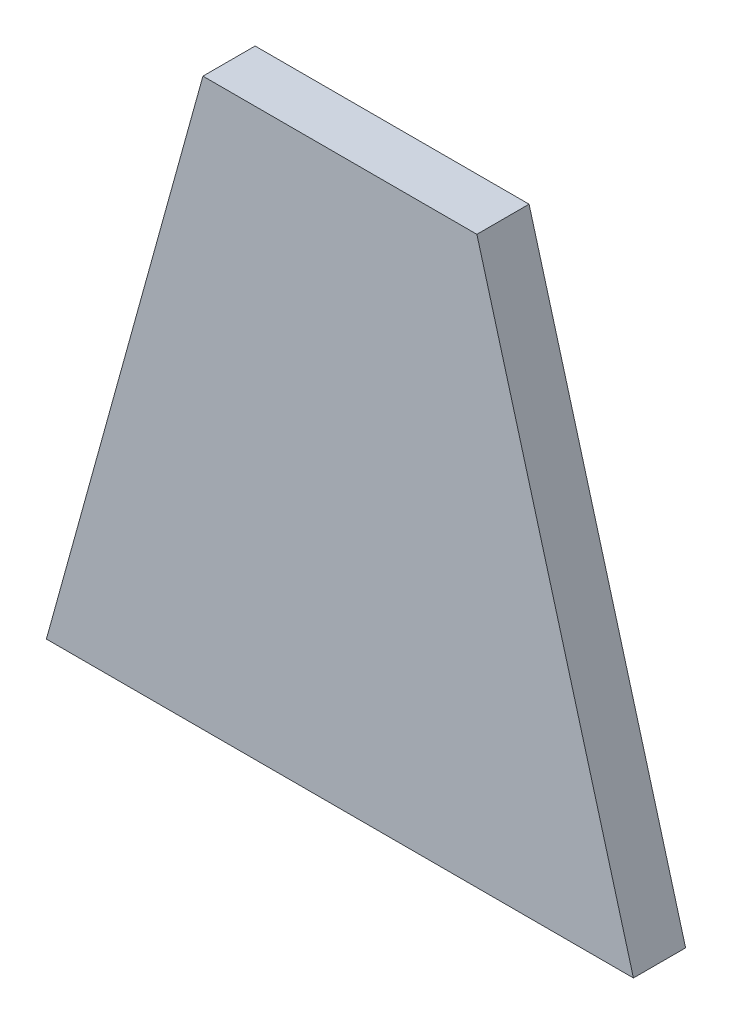
ISO-10303-21;
HEADER;
FILE_DESCRIPTION(('STEP AP214'),'2;1');
FILE_NAME('part.step','',(''),(''),'','','');
FILE_SCHEMA(('AUTOMOTIVE_DESIGN { 1 0 10303 214 1 1 1 1 }'));
ENDSEC;
DATA;
#1=APPLICATION_CONTEXT('core data for automotive mechanical design processes');
#2=APPLICATION_PROTOCOL_DEFINITION('international standard','automotive_design',2000,#1);
#3=PRODUCT_CONTEXT('',#1,'mechanical');
#4=PRODUCT('Part','Part','',(#3));
#5=PRODUCT_RELATED_PRODUCT_CATEGORY('part','',(#4));
#6=PRODUCT_DEFINITION_FORMATION('','',#4);
#7=PRODUCT_DEFINITION_CONTEXT('part definition',#1,'design');
#8=PRODUCT_DEFINITION('design','',#6,#7);
#9=PRODUCT_DEFINITION_SHAPE('','',#8);
#10=(LENGTH_UNIT() NAMED_UNIT(*) SI_UNIT(.MILLI.,.METRE.));
#11=(NAMED_UNIT(*) PLANE_ANGLE_UNIT() SI_UNIT($,.RADIAN.));
#12=(NAMED_UNIT(*) SI_UNIT($,.STERADIAN.) SOLID_ANGLE_UNIT());
#13=UNCERTAINTY_MEASURE_WITH_UNIT(LENGTH_MEASURE(1.E-05),#10,'distance_accuracy_value','');
#14=(GEOMETRIC_REPRESENTATION_CONTEXT(3) GLOBAL_UNCERTAINTY_ASSIGNED_CONTEXT((#13)) GLOBAL_UNIT_ASSIGNED_CONTEXT((#10,
#11,#12)) REPRESENTATION_CONTEXT('',''));
#15=CARTESIAN_POINT('',(0.,0.,0.));
#16=DIRECTION('',(0.,0.,1.));
#17=DIRECTION('',(1.,0.,0.));
#18=AXIS2_PLACEMENT_3D('',#15,#16,#17);
#19=CARTESIAN_POINT('',(45.,0.,4.));
#20=DIRECTION('',(0.,1.,0.));
#21=DIRECTION('',(-1.,0.,0.));
#22=AXIS2_PLACEMENT_3D('',#19,#20,#21);
#23=PLANE('',#22);
#24=DIRECTION('',(1.,0.,0.));
#25=VECTOR('',#24,1.);
#26=CARTESIAN_POINT('',(45.,0.,0.));
#27=LINE('',#26,#25);
#28=CARTESIAN_POINT('',(0.,0.,0.));
#29=VERTEX_POINT('',#28);
#30=CARTESIAN_POINT('',(45.,0.,0.));
#31=VERTEX_POINT('',#30);
#32=EDGE_CURVE('E94',#29,#31,#27,.T.);
#33=ORIENTED_EDGE('',*,*,#32,.T.);
#34=DIRECTION('',(0.,0.,-1.));
#35=VECTOR('',#34,1.);
#36=CARTESIAN_POINT('',(45.,0.,4.));
#37=LINE('',#36,#35);
#38=CARTESIAN_POINT('',(45.,0.,4.));
#39=VERTEX_POINT('',#38);
#40=EDGE_CURVE('E11',#39,#31,#37,.T.);
#41=ORIENTED_EDGE('',*,*,#40,.F.);
#42=DIRECTION('',(1.,0.,0.));
#43=VECTOR('',#42,1.);
#44=CARTESIAN_POINT('',(45.,0.,4.));
#45=LINE('',#44,#43);
#46=CARTESIAN_POINT('',(0.,0.,4.));
#47=VERTEX_POINT('',#46);
#48=EDGE_CURVE('E82',#47,#39,#45,.T.);
#49=ORIENTED_EDGE('',*,*,#48,.F.);
#50=DIRECTION('',(0.,0.,-1.));
#51=VECTOR('',#50,1.);
#52=CARTESIAN_POINT('',(0.,0.,4.));
#53=LINE('',#52,#51);
#54=EDGE_CURVE('E90',#47,#29,#53,.T.);
#55=ORIENTED_EDGE('',*,*,#54,.T.);
#56=EDGE_LOOP('',(#33,#41,#49,#55));
#57=FACE_BOUND('',#56,.T.);
#58=ADVANCED_FACE('F31',(#57),#23,.F.);
#59=CARTESIAN_POINT('',(33.,43.3704968844029,4.));
#60=DIRECTION('',(-0.963788819653397,-0.266666666666667,0.));
#61=DIRECTION('',(0.266666666666667,-0.963788819653397,0.));
#62=AXIS2_PLACEMENT_3D('',#59,#60,#61);
#63=PLANE('',#62);
#64=DIRECTION('',(-0.266666666666667,0.963788819653397,0.));
#65=VECTOR('',#64,1.);
#66=CARTESIAN_POINT('',(33.,43.3704968844029,0.));
#67=LINE('',#66,#65);
#68=CARTESIAN_POINT('',(33.,43.3704968844029,0.));
#69=VERTEX_POINT('',#68);
#70=EDGE_CURVE('E86',#31,#69,#67,.T.);
#71=ORIENTED_EDGE('',*,*,#70,.T.);
#72=DIRECTION('',(0.,0.,-1.));
#73=VECTOR('',#72,1.);
#74=CARTESIAN_POINT('',(33.,43.3704968844029,4.));
#75=LINE('',#74,#73);
#76=CARTESIAN_POINT('',(33.,43.3704968844029,4.));
#77=VERTEX_POINT('',#76);
#78=EDGE_CURVE('E39',#77,#69,#75,.T.);
#79=ORIENTED_EDGE('',*,*,#78,.F.);
#80=DIRECTION('',(-0.266666666666667,0.963788819653397,0.));
#81=VECTOR('',#80,1.);
#82=CARTESIAN_POINT('',(33.,43.3704968844029,4.));
#83=LINE('',#82,#81);
#84=EDGE_CURVE('E77',#39,#77,#83,.T.);
#85=ORIENTED_EDGE('',*,*,#84,.F.);
#86=ORIENTED_EDGE('',*,*,#40,.T.);
#87=EDGE_LOOP('',(#71,#79,#85,#86));
#88=FACE_BOUND('',#87,.T.);
#89=ADVANCED_FACE('F85',(#88),#63,.F.);
#90=CARTESIAN_POINT('',(12.,43.3704968844029,4.));
#91=DIRECTION('',(0.,-1.,0.));
#92=DIRECTION('',(0.,0.,-1.));
#93=AXIS2_PLACEMENT_3D('',#90,#91,#92);
#94=PLANE('',#93);
#95=DIRECTION('',(-1.,0.,0.));
#96=VECTOR('',#95,1.);
#97=CARTESIAN_POINT('',(12.,43.3704968844029,0.));
#98=LINE('',#97,#96);
#99=CARTESIAN_POINT('',(12.,43.3704968844029,0.));
#100=VERTEX_POINT('',#99);
#101=EDGE_CURVE('E64',#69,#100,#98,.T.);
#102=ORIENTED_EDGE('',*,*,#101,.T.);
#103=DIRECTION('',(0.,0.,-1.));
#104=VECTOR('',#103,1.);
#105=CARTESIAN_POINT('',(12.,43.3704968844029,4.));
#106=LINE('',#105,#104);
#107=CARTESIAN_POINT('',(12.,43.3704968844029,4.));
#108=VERTEX_POINT('',#107);
#109=EDGE_CURVE('E87',#108,#100,#106,.T.);
#110=ORIENTED_EDGE('',*,*,#109,.F.);
#111=DIRECTION('',(-1.,0.,0.));
#112=VECTOR('',#111,1.);
#113=CARTESIAN_POINT('',(12.,43.3704968844029,4.));
#114=LINE('',#113,#112);
#115=EDGE_CURVE('E80',#77,#108,#114,.T.);
#116=ORIENTED_EDGE('',*,*,#115,.F.);
#117=ORIENTED_EDGE('',*,*,#78,.T.);
#118=EDGE_LOOP('',(#102,#110,#116,#117));
#119=FACE_BOUND('',#118,.T.);
#120=ADVANCED_FACE('F88',(#119),#94,.F.);
#121=CARTESIAN_POINT('',(0.,0.,4.));
#122=DIRECTION('',(0.963788819653397,-0.266666666666667,0.));
#123=DIRECTION('',(0.266666666666667,0.963788819653397,0.));
#124=AXIS2_PLACEMENT_3D('',#121,#122,#123);
#125=PLANE('',#124);
#126=DIRECTION('',(-0.266666666666666,-0.963788819653397,0.));
#127=VECTOR('',#126,1.);
#128=CARTESIAN_POINT('',(0.,0.,0.));
#129=LINE('',#128,#127);
#130=EDGE_CURVE('E70',#100,#29,#129,.T.);
#131=ORIENTED_EDGE('',*,*,#130,.T.);
#132=ORIENTED_EDGE('',*,*,#54,.F.);
#133=DIRECTION('',(-0.266666666666666,-0.963788819653397,0.));
#134=VECTOR('',#133,1.);
#135=CARTESIAN_POINT('',(0.,0.,4.));
#136=LINE('',#135,#134);
#137=EDGE_CURVE('E47',#108,#47,#136,.T.);
#138=ORIENTED_EDGE('',*,*,#137,.F.);
#139=ORIENTED_EDGE('',*,*,#109,.T.);
#140=EDGE_LOOP('',(#131,#132,#138,#139));
#141=FACE_BOUND('',#140,.T.);
#142=ADVANCED_FACE('F101',(#141),#125,.F.);
#143=CARTESIAN_POINT('',(0.,0.,4.));
#144=DIRECTION('',(0.,0.,-1.));
#145=DIRECTION('',(-1.,0.,0.));
#146=AXIS2_PLACEMENT_3D('',#143,#144,#145);
#147=PLANE('',#146);
#148=ORIENTED_EDGE('',*,*,#48,.T.);
#149=ORIENTED_EDGE('',*,*,#84,.T.);
#150=ORIENTED_EDGE('',*,*,#115,.T.);
#151=ORIENTED_EDGE('',*,*,#137,.T.);
#152=EDGE_LOOP('',(#148,#149,#150,#151));
#153=FACE_BOUND('',#152,.T.);
#154=ADVANCED_FACE('F78',(#153),#147,.F.);
#155=CARTESIAN_POINT('',(0.,0.,0.));
#156=DIRECTION('',(0.,0.,-1.));
#157=DIRECTION('',(-1.,0.,0.));
#158=AXIS2_PLACEMENT_3D('',#155,#156,#157);
#159=PLANE('',#158);
#160=ORIENTED_EDGE('',*,*,#32,.F.);
#161=ORIENTED_EDGE('',*,*,#130,.F.);
#162=ORIENTED_EDGE('',*,*,#101,.F.);
#163=ORIENTED_EDGE('',*,*,#70,.F.);
#164=EDGE_LOOP('',(#160,#161,#162,#163));
#165=FACE_BOUND('',#164,.T.);
#166=ADVANCED_FACE('F104',(#165),#159,.T.);
#167=CLOSED_SHELL('',(#58,#89,#120,#142,#154,#166));
#168=MANIFOLD_SOLID_BREP('B2',#167);
#169=ADVANCED_BREP_SHAPE_REPRESENTATION('',(#18,#168),#14);
#170=SHAPE_DEFINITION_REPRESENTATION(#9,#169);
ENDSEC;
END-ISO-10303-21;
